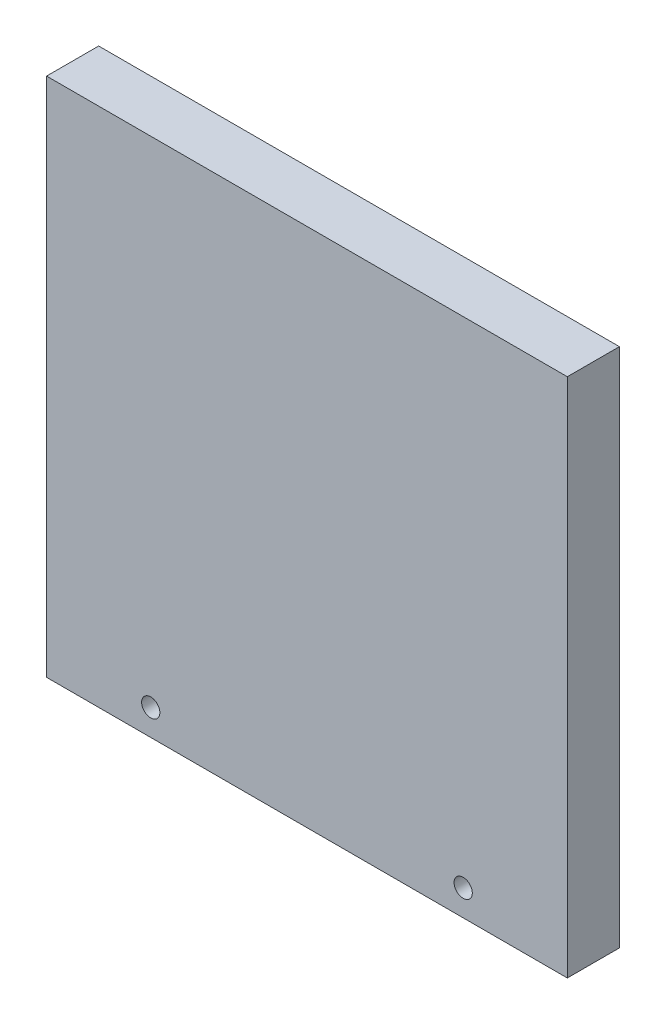
ISO-10303-21;
HEADER;
FILE_DESCRIPTION(('STEP AP214'),'2;1');
FILE_NAME('part.step','',(''),(''),'','','');
FILE_SCHEMA(('AUTOMOTIVE_DESIGN { 1 0 10303 214 1 1 1 1 }'));
ENDSEC;
DATA;
#1=APPLICATION_CONTEXT('core data for automotive mechanical design processes');
#2=APPLICATION_PROTOCOL_DEFINITION('international standard','automotive_design',2000,#1);
#3=PRODUCT_CONTEXT('',#1,'mechanical');
#4=PRODUCT('Part','Part','',(#3));
#5=PRODUCT_RELATED_PRODUCT_CATEGORY('part','',(#4));
#6=PRODUCT_DEFINITION_FORMATION('','',#4);
#7=PRODUCT_DEFINITION_CONTEXT('part definition',#1,'design');
#8=PRODUCT_DEFINITION('design','',#6,#7);
#9=PRODUCT_DEFINITION_SHAPE('','',#8);
#10=(LENGTH_UNIT() NAMED_UNIT(*) SI_UNIT(.MILLI.,.METRE.));
#11=(NAMED_UNIT(*) PLANE_ANGLE_UNIT() SI_UNIT($,.RADIAN.));
#12=(NAMED_UNIT(*) SI_UNIT($,.STERADIAN.) SOLID_ANGLE_UNIT());
#13=UNCERTAINTY_MEASURE_WITH_UNIT(LENGTH_MEASURE(1.E-05),#10,'distance_accuracy_value','');
#14=(GEOMETRIC_REPRESENTATION_CONTEXT(3) GLOBAL_UNCERTAINTY_ASSIGNED_CONTEXT((#13)) GLOBAL_UNIT_ASSIGNED_CONTEXT((#10,
#11,#12)) REPRESENTATION_CONTEXT('',''));
#15=CARTESIAN_POINT('',(0.,0.,0.));
#16=DIRECTION('',(0.,0.,1.));
#17=DIRECTION('',(1.,0.,0.));
#18=AXIS2_PLACEMENT_3D('',#15,#16,#17);
#19=CARTESIAN_POINT('',(0.,0.,0.));
#20=DIRECTION('',(0.,0.,1.));
#21=DIRECTION('',(1.,0.,0.));
#22=AXIS2_PLACEMENT_3D('',#19,#20,#21);
#23=PLANE('',#22);
#24=CARTESIAN_POINT('',(-156.253776435045,-31.797583081571,0.));
#25=DIRECTION('',(0.,0.,1.));
#26=DIRECTION('',(1.,0.,0.));
#27=AXIS2_PLACEMENT_3D('',#24,#25,#26);
#28=CIRCLE('',#27,1.75000000000001);
#29=CARTESIAN_POINT('',(-154.503776435045,-31.797583081571,0.));
#30=VERTEX_POINT('',#29);
#31=EDGE_CURVE('E216',#30,#30,#28,.T.);
#32=ORIENTED_EDGE('',*,*,#31,.T.);
#33=EDGE_LOOP('',(#32));
#34=FACE_BOUND('',#33,.T.);
#35=CARTESIAN_POINT('',(-96.2537764350453,-31.797583081571,0.));
#36=DIRECTION('',(0.,0.,1.));
#37=DIRECTION('',(1.,0.,0.));
#38=AXIS2_PLACEMENT_3D('',#35,#36,#37);
#39=CIRCLE('',#38,1.75);
#40=CARTESIAN_POINT('',(-94.5037764350453,-31.797583081571,0.));
#41=VERTEX_POINT('',#40);
#42=EDGE_CURVE('E204',#41,#41,#39,.T.);
#43=ORIENTED_EDGE('',*,*,#42,.T.);
#44=EDGE_LOOP('',(#43));
#45=FACE_BOUND('',#44,.T.);
#46=DIRECTION('',(-1.,0.,0.));
#47=VECTOR('',#46,1.);
#48=CARTESIAN_POINT('',(0.,9.20241691842901,0.));
#49=LINE('',#48,#47);
#50=CARTESIAN_POINT('',(-76.2537764350453,9.20241691842901,0.));
#51=VERTEX_POINT('',#50);
#52=CARTESIAN_POINT('',(-176.253776435045,9.20241691842901,0.));
#53=VERTEX_POINT('',#52);
#54=EDGE_CURVE('E65',#51,#53,#49,.T.);
#55=ORIENTED_EDGE('',*,*,#54,.F.);
#56=DIRECTION('',(0.,-1.,0.));
#57=VECTOR('',#56,1.);
#58=CARTESIAN_POINT('',(-76.2537764350453,0.,0.));
#59=LINE('',#58,#57);
#60=CARTESIAN_POINT('',(-76.2537764350453,-36.797583081571,0.));
#61=VERTEX_POINT('',#60);
#62=EDGE_CURVE('E251',#51,#61,#59,.T.);
#63=ORIENTED_EDGE('',*,*,#62,.T.);
#64=DIRECTION('',(1.,0.,0.));
#65=VECTOR('',#64,1.);
#66=CARTESIAN_POINT('',(0.,-36.797583081571,0.));
#67=LINE('',#66,#65);
#68=CARTESIAN_POINT('',(-176.253776435045,-36.797583081571,0.));
#69=VERTEX_POINT('',#68);
#70=EDGE_CURVE('E247',#69,#61,#67,.T.);
#71=ORIENTED_EDGE('',*,*,#70,.F.);
#72=DIRECTION('',(0.,-1.,0.));
#73=VECTOR('',#72,1.);
#74=CARTESIAN_POINT('',(-176.253776435045,0.,0.));
#75=LINE('',#74,#73);
#76=EDGE_CURVE('E243',#53,#69,#75,.T.);
#77=ORIENTED_EDGE('',*,*,#76,.F.);
#78=EDGE_LOOP('',(#55,#63,#71,#77));
#79=FACE_BOUND('',#78,.T.);
#80=ADVANCED_FACE('F41',(#34,#45,#79),#23,.F.);
#81=CARTESIAN_POINT('',(0.,63.202416918429,10.));
#82=DIRECTION('',(0.,1.,0.));
#83=DIRECTION('',(0.,0.,1.));
#84=AXIS2_PLACEMENT_3D('',#81,#82,#83);
#85=PLANE('',#84);
#86=DIRECTION('',(1.,0.,0.));
#87=VECTOR('',#86,1.);
#88=CARTESIAN_POINT('',(0.,63.202416918429,0.));
#89=LINE('',#88,#87);
#90=CARTESIAN_POINT('',(-176.253776435045,63.202416918429,0.));
#91=VERTEX_POINT('',#90);
#92=CARTESIAN_POINT('',(-76.2537764350452,63.202416918429,0.));
#93=VERTEX_POINT('',#92);
#94=EDGE_CURVE('E239',#91,#93,#89,.T.);
#95=ORIENTED_EDGE('',*,*,#94,.F.);
#96=DIRECTION('',(0.,0.,-1.));
#97=VECTOR('',#96,1.);
#98=CARTESIAN_POINT('',(-176.253776435045,63.202416918429,10.));
#99=LINE('',#98,#97);
#100=CARTESIAN_POINT('',(-176.253776435045,63.202416918429,10.));
#101=VERTEX_POINT('',#100);
#102=EDGE_CURVE('E11',#101,#91,#99,.T.);
#103=ORIENTED_EDGE('',*,*,#102,.F.);
#104=DIRECTION('',(1.,0.,0.));
#105=VECTOR('',#104,1.);
#106=CARTESIAN_POINT('',(0.,63.202416918429,10.));
#107=LINE('',#106,#105);
#108=CARTESIAN_POINT('',(-76.2537764350452,63.202416918429,10.));
#109=VERTEX_POINT('',#108);
#110=EDGE_CURVE('E215',#101,#109,#107,.T.);
#111=ORIENTED_EDGE('',*,*,#110,.T.);
#112=DIRECTION('',(0.,0.,-1.));
#113=VECTOR('',#112,1.);
#114=CARTESIAN_POINT('',(-76.2537764350452,63.202416918429,10.));
#115=LINE('',#114,#113);
#116=EDGE_CURVE('E235',#109,#93,#115,.T.);
#117=ORIENTED_EDGE('',*,*,#116,.T.);
#118=EDGE_LOOP('',(#95,#103,#111,#117));
#119=FACE_BOUND('',#118,.T.);
#120=ADVANCED_FACE('F286',(#119),#85,.T.);
#121=CARTESIAN_POINT('',(-176.253776435045,0.,10.));
#122=DIRECTION('',(1.,0.,0.));
#123=DIRECTION('',(0.,1.,0.));
#124=AXIS2_PLACEMENT_3D('',#121,#122,#123);
#125=PLANE('',#124);
#126=CARTESIAN_POINT('',(-176.253776435045,17.202416918429,0.));
#127=VERTEX_POINT('',#126);
#128=EDGE_CURVE('E244',#91,#127,#75,.T.);
#129=ORIENTED_EDGE('',*,*,#128,.T.);
#130=DIRECTION('',(0.,-1.,0.));
#131=VECTOR('',#130,1.);
#132=CARTESIAN_POINT('',(-176.253776435045,17.202416918429,0.));
#133=LINE('',#132,#131);
#134=EDGE_CURVE('E170',#127,#53,#133,.T.);
#135=ORIENTED_EDGE('',*,*,#134,.T.);
#136=ORIENTED_EDGE('',*,*,#76,.T.);
#137=DIRECTION('',(0.,0.,-1.));
#138=VECTOR('',#137,1.);
#139=CARTESIAN_POINT('',(-176.253776435045,-36.797583081571,10.));
#140=LINE('',#139,#138);
#141=CARTESIAN_POINT('',(-176.253776435045,-36.797583081571,10.));
#142=VERTEX_POINT('',#141);
#143=EDGE_CURVE('E50',#142,#69,#140,.T.);
#144=ORIENTED_EDGE('',*,*,#143,.F.);
#145=DIRECTION('',(0.,-1.,0.));
#146=VECTOR('',#145,1.);
#147=CARTESIAN_POINT('',(-176.253776435045,0.,10.));
#148=LINE('',#147,#146);
#149=EDGE_CURVE('E220',#101,#142,#148,.T.);
#150=ORIENTED_EDGE('',*,*,#149,.F.);
#151=ORIENTED_EDGE('',*,*,#102,.T.);
#152=EDGE_LOOP('',(#129,#135,#136,#144,#150,#151));
#153=FACE_BOUND('',#152,.T.);
#154=ADVANCED_FACE('F272',(#153),#125,.F.);
#155=CARTESIAN_POINT('',(0.,-36.797583081571,10.));
#156=DIRECTION('',(0.,1.,0.));
#157=DIRECTION('',(0.,0.,1.));
#158=AXIS2_PLACEMENT_3D('',#155,#156,#157);
#159=PLANE('',#158);
#160=ORIENTED_EDGE('',*,*,#70,.T.);
#161=DIRECTION('',(0.,0.,-1.));
#162=VECTOR('',#161,1.);
#163=CARTESIAN_POINT('',(-76.2537764350453,-36.797583081571,10.));
#164=LINE('',#163,#162);
#165=CARTESIAN_POINT('',(-76.2537764350453,-36.797583081571,10.));
#166=VERTEX_POINT('',#165);
#167=EDGE_CURVE('E260',#166,#61,#164,.T.);
#168=ORIENTED_EDGE('',*,*,#167,.F.);
#169=DIRECTION('',(1.,0.,0.));
#170=VECTOR('',#169,1.);
#171=CARTESIAN_POINT('',(0.,-36.797583081571,10.));
#172=LINE('',#171,#170);
#173=EDGE_CURVE('E224',#142,#166,#172,.T.);
#174=ORIENTED_EDGE('',*,*,#173,.F.);
#175=ORIENTED_EDGE('',*,*,#143,.T.);
#176=EDGE_LOOP('',(#160,#168,#174,#175));
#177=FACE_BOUND('',#176,.T.);
#178=ADVANCED_FACE('F267',(#177),#159,.F.);
#179=CARTESIAN_POINT('',(-76.2537764350453,0.,10.));
#180=DIRECTION('',(1.,0.,0.));
#181=DIRECTION('',(0.,1.,0.));
#182=AXIS2_PLACEMENT_3D('',#179,#180,#181);
#183=PLANE('',#182);
#184=CARTESIAN_POINT('',(-76.2537764350452,17.202416918429,0.));
#185=VERTEX_POINT('',#184);
#186=EDGE_CURVE('E252',#93,#185,#59,.T.);
#187=ORIENTED_EDGE('',*,*,#186,.F.);
#188=ORIENTED_EDGE('',*,*,#116,.F.);
#189=DIRECTION('',(0.,-1.,0.));
#190=VECTOR('',#189,1.);
#191=CARTESIAN_POINT('',(-76.2537764350453,0.,10.));
#192=LINE('',#191,#190);
#193=EDGE_CURVE('E227',#109,#166,#192,.T.);
#194=ORIENTED_EDGE('',*,*,#193,.T.);
#195=ORIENTED_EDGE('',*,*,#167,.T.);
#196=ORIENTED_EDGE('',*,*,#62,.F.);
#197=DIRECTION('',(0.,-1.,0.));
#198=VECTOR('',#197,1.);
#199=CARTESIAN_POINT('',(-76.2537764350453,17.202416918429,0.));
#200=LINE('',#199,#198);
#201=EDGE_CURVE('E147',#185,#51,#200,.T.);
#202=ORIENTED_EDGE('',*,*,#201,.F.);
#203=EDGE_LOOP('',(#187,#188,#194,#195,#196,#202));
#204=FACE_BOUND('',#203,.T.);
#205=ADVANCED_FACE('F279',(#204),#183,.T.);
#206=CARTESIAN_POINT('',(-96.2537764350453,-31.797583081571,10.));
#207=DIRECTION('',(0.,0.,-1.));
#208=DIRECTION('',(-1.,0.,0.));
#209=AXIS2_PLACEMENT_3D('',#206,#207,#208);
#210=CYLINDRICAL_SURFACE('',#209,1.75);
#211=CARTESIAN_POINT('',(-96.2537764350453,-31.797583081571,10.));
#212=DIRECTION('',(0.,0.,1.));
#213=DIRECTION('',(1.,0.,0.));
#214=AXIS2_PLACEMENT_3D('',#211,#212,#213);
#215=CIRCLE('',#214,1.75);
#216=CARTESIAN_POINT('',(-94.5037764350453,-31.797583081571,10.));
#217=VERTEX_POINT('',#216);
#218=EDGE_CURVE('E211',#217,#217,#215,.T.);
#219=ORIENTED_EDGE('',*,*,#218,.T.);
#220=EDGE_LOOP('',(#219));
#221=FACE_BOUND('',#220,.T.);
#222=ORIENTED_EDGE('',*,*,#42,.F.);
#223=EDGE_LOOP('',(#222));
#224=FACE_BOUND('',#223,.T.);
#225=ADVANCED_FACE('F43',(#221,#224),#210,.F.);
#226=CARTESIAN_POINT('',(-156.253776435045,-31.797583081571,10.));
#227=DIRECTION('',(0.,0.,-1.));
#228=DIRECTION('',(-1.,0.,0.));
#229=AXIS2_PLACEMENT_3D('',#226,#227,#228);
#230=CYLINDRICAL_SURFACE('',#229,1.75000000000001);
#231=CARTESIAN_POINT('',(-156.253776435045,-31.797583081571,10.));
#232=DIRECTION('',(0.,0.,1.));
#233=DIRECTION('',(1.,0.,0.));
#234=AXIS2_PLACEMENT_3D('',#231,#232,#233);
#235=CIRCLE('',#234,1.75000000000001);
#236=CARTESIAN_POINT('',(-154.503776435045,-31.797583081571,10.));
#237=VERTEX_POINT('',#236);
#238=EDGE_CURVE('E231',#237,#237,#235,.T.);
#239=ORIENTED_EDGE('',*,*,#238,.T.);
#240=EDGE_LOOP('',(#239));
#241=FACE_BOUND('',#240,.T.);
#242=ORIENTED_EDGE('',*,*,#31,.F.);
#243=EDGE_LOOP('',(#242));
#244=FACE_BOUND('',#243,.T.);
#245=ADVANCED_FACE('F322',(#241,#244),#230,.F.);
#246=CARTESIAN_POINT('',(0.,0.,10.));
#247=DIRECTION('',(0.,0.,1.));
#248=DIRECTION('',(1.,0.,0.));
#249=AXIS2_PLACEMENT_3D('',#246,#247,#248);
#250=PLANE('',#249);
#251=ORIENTED_EDGE('',*,*,#218,.F.);
#252=EDGE_LOOP('',(#251));
#253=FACE_BOUND('',#252,.T.);
#254=ORIENTED_EDGE('',*,*,#110,.F.);
#255=ORIENTED_EDGE('',*,*,#149,.T.);
#256=ORIENTED_EDGE('',*,*,#173,.T.);
#257=ORIENTED_EDGE('',*,*,#193,.F.);
#258=EDGE_LOOP('',(#254,#255,#256,#257));
#259=FACE_BOUND('',#258,.T.);
#260=ORIENTED_EDGE('',*,*,#238,.F.);
#261=EDGE_LOOP('',(#260));
#262=FACE_BOUND('',#261,.T.);
#263=ADVANCED_FACE('F282',(#253,#259,#262),#250,.T.);
#264=ORIENTED_EDGE('',*,*,#186,.T.);
#265=DIRECTION('',(-1.,0.,0.));
#266=VECTOR('',#265,1.);
#267=CARTESIAN_POINT('',(0.,17.202416918429,0.));
#268=LINE('',#267,#266);
#269=EDGE_CURVE('E57',#185,#127,#268,.T.);
#270=ORIENTED_EDGE('',*,*,#269,.T.);
#271=ORIENTED_EDGE('',*,*,#128,.F.);
#272=ORIENTED_EDGE('',*,*,#94,.T.);
#273=EDGE_LOOP('',(#264,#270,#271,#272));
#274=FACE_BOUND('',#273,.T.);
#275=ADVANCED_FACE('F287',(#274),#23,.F.);
#276=CARTESIAN_POINT('',(-126.253776435045,17.202416918429,-15.));
#277=DIRECTION('',(0.,-1.,0.));
#278=DIRECTION('',(0.,0.,-1.));
#279=AXIS2_PLACEMENT_3D('',#276,#277,#278);
#280=CYLINDRICAL_SURFACE('',#279,11.);
#281=CARTESIAN_POINT('',(-126.253776435045,9.20241691842901,-15.));
#282=DIRECTION('',(0.,1.,0.));
#283=DIRECTION('',(0.,0.,1.));
#284=AXIS2_PLACEMENT_3D('',#281,#282,#283);
#285=CIRCLE('',#284,11.);
#286=CARTESIAN_POINT('',(-131.753776435045,9.20241691842901,-24.5262794416288));
#287=VERTEX_POINT('',#286);
#288=CARTESIAN_POINT('',(-120.753776435045,9.20241691842901,-24.5262794416288));
#289=VERTEX_POINT('',#288);
#290=EDGE_CURVE('E182',#287,#289,#285,.T.);
#291=ORIENTED_EDGE('',*,*,#290,.F.);
#292=DIRECTION('',(0.,-1.,0.));
#293=VECTOR('',#292,1.);
#294=CARTESIAN_POINT('',(-131.753776435045,17.202416918429,-24.5262794416288));
#295=LINE('',#294,#293);
#296=CARTESIAN_POINT('',(-131.753776435045,17.202416918429,-24.5262794416288));
#297=VERTEX_POINT('',#296);
#298=EDGE_CURVE('E201',#297,#287,#295,.T.);
#299=ORIENTED_EDGE('',*,*,#298,.F.);
#300=CARTESIAN_POINT('',(-126.253776435045,17.202416918429,-15.));
#301=DIRECTION('',(0.,1.,0.));
#302=DIRECTION('',(0.,0.,1.));
#303=AXIS2_PLACEMENT_3D('',#300,#301,#302);
#304=CIRCLE('',#303,11.);
#305=CARTESIAN_POINT('',(-120.753776435045,17.202416918429,-24.5262794416288));
#306=VERTEX_POINT('',#305);
#307=EDGE_CURVE('E156',#297,#306,#304,.T.);
#308=ORIENTED_EDGE('',*,*,#307,.T.);
#309=DIRECTION('',(0.,-1.,0.));
#310=VECTOR('',#309,1.);
#311=CARTESIAN_POINT('',(-120.753776435045,17.202416918429,-24.5262794416288));
#312=LINE('',#311,#310);
#313=EDGE_CURVE('E194',#306,#289,#312,.T.);
#314=ORIENTED_EDGE('',*,*,#313,.T.);
#315=EDGE_LOOP('',(#291,#299,#308,#314));
#316=FACE_BOUND('',#315,.T.);
#317=ADVANCED_FACE('F315',(#316),#280,.F.);
#318=CARTESIAN_POINT('',(-43.5586346371459,17.202416918429,-75.4457682998644));
#319=DIRECTION('',(-0.500000000000009,0.,-0.866025403784434));
#320=DIRECTION('',(-0.866025403784434,0.,0.500000000000009));
#321=AXIS2_PLACEMENT_3D('',#318,#319,#320);
#322=PLANE('',#321);
#323=DIRECTION('',(0.866025403784434,0.,-0.500000000000009));
#324=VECTOR('',#323,1.);
#325=CARTESIAN_POINT('',(-43.5586346371459,9.20241691842901,-75.4457682998644));
#326=LINE('',#325,#324);
#327=CARTESIAN_POINT('',(-126.253776435045,9.20241691842901,-27.7017059221718));
#328=VERTEX_POINT('',#327);
#329=EDGE_CURVE('E186',#287,#328,#326,.T.);
#330=ORIENTED_EDGE('',*,*,#329,.T.);
#331=DIRECTION('',(0.,-1.,0.));
#332=VECTOR('',#331,1.);
#333=CARTESIAN_POINT('',(-126.253776435045,17.202416918429,-27.7017059221718));
#334=LINE('',#333,#332);
#335=CARTESIAN_POINT('',(-126.253776435045,17.202416918429,-27.7017059221718));
#336=VERTEX_POINT('',#335);
#337=EDGE_CURVE('E197',#336,#328,#334,.T.);
#338=ORIENTED_EDGE('',*,*,#337,.F.);
#339=DIRECTION('',(0.866025403784434,0.,-0.500000000000009));
#340=VECTOR('',#339,1.);
#341=CARTESIAN_POINT('',(-43.5586346371459,17.202416918429,-75.4457682998644));
#342=LINE('',#341,#340);
#343=EDGE_CURVE('E163',#297,#336,#342,.T.);
#344=ORIENTED_EDGE('',*,*,#343,.F.);
#345=ORIENTED_EDGE('',*,*,#298,.T.);
#346=EDGE_LOOP('',(#330,#338,#344,#345));
#347=FACE_BOUND('',#346,.T.);
#348=ADVANCED_FACE('F320',(#347),#322,.F.);
#349=CARTESIAN_POINT('',(-76.2537764350453,17.202416918429,-41.6666666666666));
#350=DIRECTION('',(0.,-1.,0.));
#351=DIRECTION('',(0.,0.,-1.));
#352=AXIS2_PLACEMENT_3D('',#349,#350,#351);
#353=CYLINDRICAL_SURFACE('',#352,41.6666666666666);
#354=CARTESIAN_POINT('',(-76.2537764350453,9.20241691842901,-41.6666666666666));
#355=DIRECTION('',(0.,1.,0.));
#356=DIRECTION('',(0.,0.,1.));
#357=AXIS2_PLACEMENT_3D('',#354,#355,#356);
#358=CIRCLE('',#357,41.6666666666666);
#359=CARTESIAN_POINT('',(-113.018482317398,9.20241691842901,-22.0588235294118));
#360=VERTEX_POINT('',#359);
#361=EDGE_CURVE('E142',#51,#360,#358,.F.);
#362=ORIENTED_EDGE('',*,*,#361,.T.);
#363=DIRECTION('',(0.,-1.,0.));
#364=VECTOR('',#363,1.);
#365=CARTESIAN_POINT('',(-113.018482317398,17.202416918429,-22.0588235294118));
#366=LINE('',#365,#364);
#367=CARTESIAN_POINT('',(-113.018482317398,17.202416918429,-22.0588235294118));
#368=VERTEX_POINT('',#367);
#369=EDGE_CURVE('E139',#368,#360,#366,.T.);
#370=ORIENTED_EDGE('',*,*,#369,.F.);
#371=CARTESIAN_POINT('',(-76.2537764350453,17.202416918429,-41.6666666666666));
#372=DIRECTION('',(0.,1.,0.));
#373=DIRECTION('',(0.,0.,1.));
#374=AXIS2_PLACEMENT_3D('',#371,#372,#373);
#375=CIRCLE('',#374,41.6666666666666);
#376=EDGE_CURVE('E126',#185,#368,#375,.F.);
#377=ORIENTED_EDGE('',*,*,#376,.F.);
#378=ORIENTED_EDGE('',*,*,#201,.T.);
#379=EDGE_LOOP('',(#362,#370,#377,#378));
#380=FACE_BOUND('',#379,.T.);
#381=ADVANCED_FACE('F140',(#380),#353,.F.);
#382=CARTESIAN_POINT('',(-126.253776435045,17.202416918429,-15.));
#383=DIRECTION('',(0.,-1.,0.));
#384=DIRECTION('',(0.,0.,-1.));
#385=AXIS2_PLACEMENT_3D('',#382,#383,#384);
#386=CYLINDRICAL_SURFACE('',#385,15.);
#387=CARTESIAN_POINT('',(-126.253776435045,9.20241691842901,-15.));
#388=DIRECTION('',(0.,1.,0.));
#389=DIRECTION('',(0.,0.,1.));
#390=AXIS2_PLACEMENT_3D('',#387,#388,#389);
#391=CIRCLE('',#390,15.);
#392=CARTESIAN_POINT('',(-139.489070552692,9.20241691842901,-22.0588235294118));
#393=VERTEX_POINT('',#392);
#394=EDGE_CURVE('E175',#360,#393,#391,.T.);
#395=ORIENTED_EDGE('',*,*,#394,.T.);
#396=DIRECTION('',(0.,-1.,0.));
#397=VECTOR('',#396,1.);
#398=CARTESIAN_POINT('',(-139.489070552692,17.202416918429,-22.0588235294118));
#399=LINE('',#398,#397);
#400=CARTESIAN_POINT('',(-139.489070552692,17.202416918429,-22.0588235294118));
#401=VERTEX_POINT('',#400);
#402=EDGE_CURVE('E148',#401,#393,#399,.T.);
#403=ORIENTED_EDGE('',*,*,#402,.F.);
#404=CARTESIAN_POINT('',(-126.253776435045,17.202416918429,-15.));
#405=DIRECTION('',(0.,1.,0.));
#406=DIRECTION('',(0.,0.,1.));
#407=AXIS2_PLACEMENT_3D('',#404,#405,#406);
#408=CIRCLE('',#407,15.);
#409=EDGE_CURVE('E132',#368,#401,#408,.T.);
#410=ORIENTED_EDGE('',*,*,#409,.F.);
#411=ORIENTED_EDGE('',*,*,#369,.T.);
#412=EDGE_LOOP('',(#395,#403,#410,#411));
#413=FACE_BOUND('',#412,.T.);
#414=ADVANCED_FACE('F150',(#413),#386,.T.);
#415=CARTESIAN_POINT('',(-176.253776435045,17.202416918429,-41.6666666666667));
#416=DIRECTION('',(0.,-1.,0.));
#417=DIRECTION('',(0.,0.,-1.));
#418=AXIS2_PLACEMENT_3D('',#415,#416,#417);
#419=CYLINDRICAL_SURFACE('',#418,41.6666666666667);
#420=CARTESIAN_POINT('',(-176.253776435045,9.20241691842901,-41.6666666666667));
#421=DIRECTION('',(0.,1.,0.));
#422=DIRECTION('',(0.,0.,1.));
#423=AXIS2_PLACEMENT_3D('',#420,#421,#422);
#424=CIRCLE('',#423,41.6666666666667);
#425=EDGE_CURVE('E178',#53,#393,#424,.T.);
#426=ORIENTED_EDGE('',*,*,#425,.F.);
#427=ORIENTED_EDGE('',*,*,#134,.F.);
#428=CARTESIAN_POINT('',(-176.253776435045,17.202416918429,-41.6666666666667));
#429=DIRECTION('',(0.,1.,0.));
#430=DIRECTION('',(0.,0.,1.));
#431=AXIS2_PLACEMENT_3D('',#428,#429,#430);
#432=CIRCLE('',#431,41.6666666666667);
#433=EDGE_CURVE('E153',#127,#401,#432,.T.);
#434=ORIENTED_EDGE('',*,*,#433,.T.);
#435=ORIENTED_EDGE('',*,*,#402,.T.);
#436=EDGE_LOOP('',(#426,#427,#434,#435));
#437=FACE_BOUND('',#436,.T.);
#438=ADVANCED_FACE('F293',(#437),#419,.F.);
#439=CARTESIAN_POINT('',(-19.5682535803787,17.202416918429,33.8932094166069));
#440=DIRECTION('',(0.500000000000006,0.,-0.866025403784435));
#441=DIRECTION('',(-0.866025403784435,0.,-0.500000000000006));
#442=AXIS2_PLACEMENT_3D('',#439,#440,#441);
#443=PLANE('',#442);
#444=DIRECTION('',(0.866025403784435,0.,0.500000000000006));
#445=VECTOR('',#444,1.);
#446=CARTESIAN_POINT('',(-19.5682535803787,9.20241691842901,33.8932094166069));
#447=LINE('',#446,#445);
#448=EDGE_CURVE('E190',#328,#289,#447,.T.);
#449=ORIENTED_EDGE('',*,*,#448,.T.);
#450=ORIENTED_EDGE('',*,*,#313,.F.);
#451=DIRECTION('',(0.866025403784435,0.,0.500000000000006));
#452=VECTOR('',#451,1.);
#453=CARTESIAN_POINT('',(-19.5682535803787,17.202416918429,33.8932094166069));
#454=LINE('',#453,#452);
#455=EDGE_CURVE('E167',#336,#306,#454,.T.);
#456=ORIENTED_EDGE('',*,*,#455,.F.);
#457=ORIENTED_EDGE('',*,*,#337,.T.);
#458=EDGE_LOOP('',(#449,#450,#456,#457));
#459=FACE_BOUND('',#458,.T.);
#460=ADVANCED_FACE('F295',(#459),#443,.F.);
#461=CARTESIAN_POINT('',(0.,17.202416918429,0.));
#462=DIRECTION('',(0.,1.,0.));
#463=DIRECTION('',(0.,0.,1.));
#464=AXIS2_PLACEMENT_3D('',#461,#462,#463);
#465=PLANE('',#464);
#466=ORIENTED_EDGE('',*,*,#269,.F.);
#467=ORIENTED_EDGE('',*,*,#376,.T.);
#468=ORIENTED_EDGE('',*,*,#409,.T.);
#469=ORIENTED_EDGE('',*,*,#433,.F.);
#470=EDGE_LOOP('',(#466,#467,#468,#469));
#471=FACE_BOUND('',#470,.T.);
#472=ORIENTED_EDGE('',*,*,#307,.F.);
#473=ORIENTED_EDGE('',*,*,#343,.T.);
#474=ORIENTED_EDGE('',*,*,#455,.T.);
#475=EDGE_LOOP('',(#472,#473,#474));
#476=FACE_BOUND('',#475,.T.);
#477=ADVANCED_FACE('F128',(#471,#476),#465,.T.);
#478=CARTESIAN_POINT('',(0.,9.20241691842901,0.));
#479=DIRECTION('',(0.,1.,0.));
#480=DIRECTION('',(0.,0.,1.));
#481=AXIS2_PLACEMENT_3D('',#478,#479,#480);
#482=PLANE('',#481);
#483=ORIENTED_EDGE('',*,*,#54,.T.);
#484=ORIENTED_EDGE('',*,*,#425,.T.);
#485=ORIENTED_EDGE('',*,*,#394,.F.);
#486=ORIENTED_EDGE('',*,*,#361,.F.);
#487=EDGE_LOOP('',(#483,#484,#485,#486));
#488=FACE_BOUND('',#487,.T.);
#489=ORIENTED_EDGE('',*,*,#290,.T.);
#490=ORIENTED_EDGE('',*,*,#448,.F.);
#491=ORIENTED_EDGE('',*,*,#329,.F.);
#492=EDGE_LOOP('',(#489,#490,#491));
#493=FACE_BOUND('',#492,.T.);
#494=ADVANCED_FACE('F289',(#488,#493),#482,.F.);
#495=CLOSED_SHELL('',(#80,#120,#154,#178,#205,#225,#245,#263,#275,#317,#348,#381,#414,#438,#460,
#477,#494));
#496=MANIFOLD_SOLID_BREP('B2',#495);
#497=ADVANCED_BREP_SHAPE_REPRESENTATION('',(#18,#496),#14);
#498=SHAPE_DEFINITION_REPRESENTATION(#9,#497);
ENDSEC;
END-ISO-10303-21;
